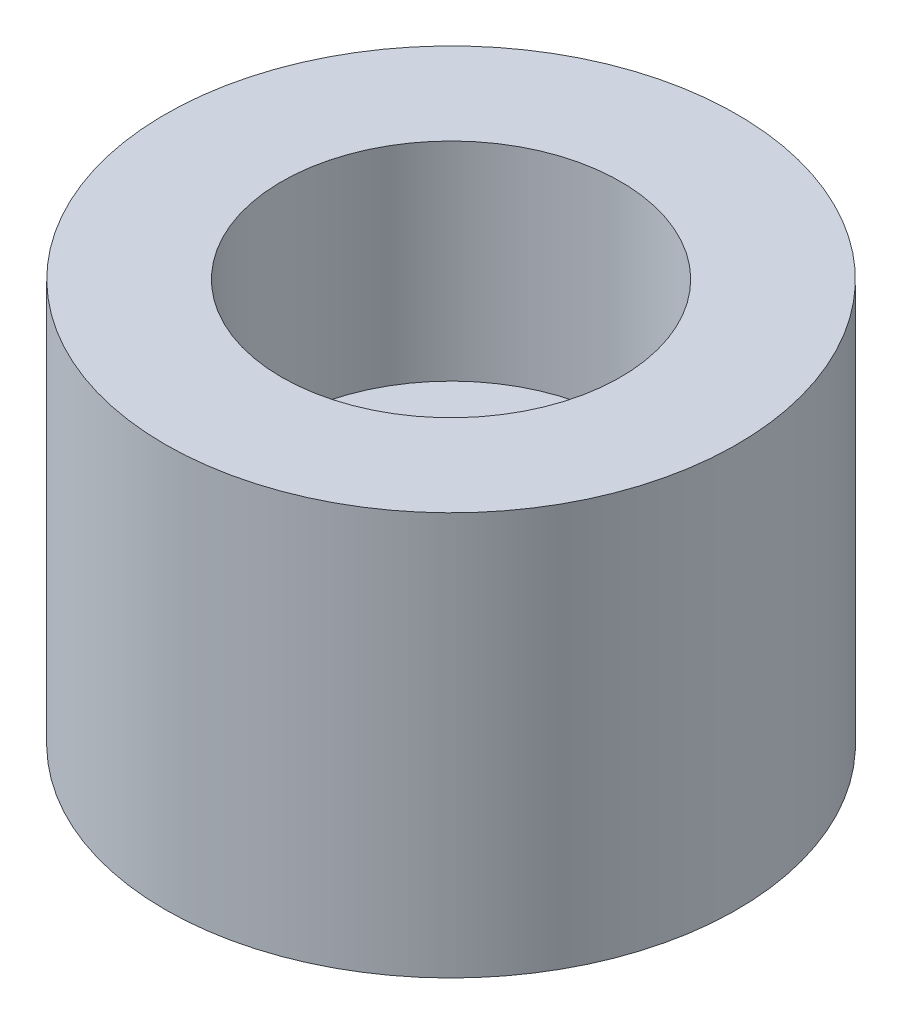
ISO-10303-21;
HEADER;
FILE_DESCRIPTION(('STEP AP214'),'2;1');
FILE_NAME('part.step','',(''),(''),'','','');
FILE_SCHEMA(('AUTOMOTIVE_DESIGN { 1 0 10303 214 1 1 1 1 }'));
ENDSEC;
DATA;
#1=APPLICATION_CONTEXT('core data for automotive mechanical design processes');
#2=APPLICATION_PROTOCOL_DEFINITION('international standard','automotive_design',2000,#1);
#3=PRODUCT_CONTEXT('',#1,'mechanical');
#4=PRODUCT('Part','Part','',(#3));
#5=PRODUCT_RELATED_PRODUCT_CATEGORY('part','',(#4));
#6=PRODUCT_DEFINITION_FORMATION('','',#4);
#7=PRODUCT_DEFINITION_CONTEXT('part definition',#1,'design');
#8=PRODUCT_DEFINITION('design','',#6,#7);
#9=PRODUCT_DEFINITION_SHAPE('','',#8);
#10=(LENGTH_UNIT() NAMED_UNIT(*) SI_UNIT(.MILLI.,.METRE.));
#11=(NAMED_UNIT(*) PLANE_ANGLE_UNIT() SI_UNIT($,.RADIAN.));
#12=(NAMED_UNIT(*) SI_UNIT($,.STERADIAN.) SOLID_ANGLE_UNIT());
#13=UNCERTAINTY_MEASURE_WITH_UNIT(LENGTH_MEASURE(1.E-05),#10,'distance_accuracy_value','');
#14=(GEOMETRIC_REPRESENTATION_CONTEXT(3) GLOBAL_UNCERTAINTY_ASSIGNED_CONTEXT((#13)) GLOBAL_UNIT_ASSIGNED_CONTEXT((#10,
#11,#12)) REPRESENTATION_CONTEXT('',''));
#15=CARTESIAN_POINT('',(0.,0.,0.));
#16=DIRECTION('',(0.,0.,1.));
#17=DIRECTION('',(1.,0.,0.));
#18=AXIS2_PLACEMENT_3D('',#15,#16,#17);
#19=CARTESIAN_POINT('',(0.,0.,0.));
#20=DIRECTION('',(0.,1.,0.));
#21=DIRECTION('',(0.,0.,1.));
#22=AXIS2_PLACEMENT_3D('',#19,#20,#21);
#23=PLANE('',#22);
#24=CARTESIAN_POINT('',(0.,0.,0.));
#25=DIRECTION('',(0.,1.,0.));
#26=DIRECTION('',(0.,0.,1.));
#27=AXIS2_PLACEMENT_3D('',#24,#25,#26);
#28=CIRCLE('',#27,27.5);
#29=CARTESIAN_POINT('',(0.,0.,27.5));
#30=VERTEX_POINT('',#29);
#31=EDGE_CURVE('E37',#30,#30,#28,.T.);
#32=ORIENTED_EDGE('',*,*,#31,.F.);
#33=EDGE_LOOP('',(#32));
#34=FACE_BOUND('',#33,.T.);
#35=CARTESIAN_POINT('',(0.,0.,0.));
#36=DIRECTION('',(0.,1.,0.));
#37=DIRECTION('',(0.,0.,1.));
#38=AXIS2_PLACEMENT_3D('',#35,#36,#37);
#39=CIRCLE('',#38,23.9);
#40=CARTESIAN_POINT('',(0.,0.,23.9));
#41=VERTEX_POINT('',#40);
#42=EDGE_CURVE('E41',#41,#41,#39,.T.);
#43=ORIENTED_EDGE('',*,*,#42,.T.);
#44=EDGE_LOOP('',(#43));
#45=FACE_BOUND('',#44,.T.);
#46=ADVANCED_FACE('F30',(#34,#45),#23,.F.);
#47=CARTESIAN_POINT('',(0.,10.75,0.));
#48=DIRECTION('',(0.,-1.,0.));
#49=DIRECTION('',(0.,0.,-1.));
#50=AXIS2_PLACEMENT_3D('',#47,#48,#49);
#51=CYLINDRICAL_SURFACE('',#50,27.5);
#52=ORIENTED_EDGE('',*,*,#31,.T.);
#53=EDGE_LOOP('',(#52));
#54=FACE_BOUND('',#53,.T.);
#55=CARTESIAN_POINT('',(0.,38.75,0.));
#56=DIRECTION('',(0.,1.,0.));
#57=DIRECTION('',(0.,0.,1.));
#58=AXIS2_PLACEMENT_3D('',#55,#56,#57);
#59=CIRCLE('',#58,27.5);
#60=CARTESIAN_POINT('',(0.,38.75,27.5));
#61=VERTEX_POINT('',#60);
#62=EDGE_CURVE('E56',#61,#61,#59,.T.);
#63=ORIENTED_EDGE('',*,*,#62,.F.);
#64=EDGE_LOOP('',(#63));
#65=FACE_BOUND('',#64,.T.);
#66=ADVANCED_FACE('F32',(#54,#65),#51,.T.);
#67=CARTESIAN_POINT('',(0.,10.75,0.));
#68=DIRECTION('',(0.,-1.,0.));
#69=DIRECTION('',(0.,0.,-1.));
#70=AXIS2_PLACEMENT_3D('',#67,#68,#69);
#71=CYLINDRICAL_SURFACE('',#70,23.9);
#72=CARTESIAN_POINT('',(0.,10.75,0.));
#73=DIRECTION('',(0.,1.,0.));
#74=DIRECTION('',(0.,0.,1.));
#75=AXIS2_PLACEMENT_3D('',#72,#73,#74);
#76=CIRCLE('',#75,23.9);
#77=CARTESIAN_POINT('',(0.,10.75,23.9));
#78=VERTEX_POINT('',#77);
#79=EDGE_CURVE('E45',#78,#78,#76,.T.);
#80=ORIENTED_EDGE('',*,*,#79,.T.);
#81=EDGE_LOOP('',(#80));
#82=FACE_BOUND('',#81,.T.);
#83=ORIENTED_EDGE('',*,*,#42,.F.);
#84=EDGE_LOOP('',(#83));
#85=FACE_BOUND('',#84,.T.);
#86=ADVANCED_FACE('F85',(#82,#85),#71,.F.);
#87=CARTESIAN_POINT('',(0.,10.75,0.));
#88=DIRECTION('',(0.,1.,0.));
#89=DIRECTION('',(0.,0.,1.));
#90=AXIS2_PLACEMENT_3D('',#87,#88,#89);
#91=PLANE('',#90);
#92=CARTESIAN_POINT('',(0.,10.75,0.));
#93=DIRECTION('',(0.,1.,0.));
#94=DIRECTION('',(0.,0.,1.));
#95=AXIS2_PLACEMENT_3D('',#92,#93,#94);
#96=CIRCLE('',#95,21.5);
#97=CARTESIAN_POINT('',(0.,10.75,21.5));
#98=VERTEX_POINT('',#97);
#99=EDGE_CURVE('E50',#98,#98,#96,.T.);
#100=ORIENTED_EDGE('',*,*,#99,.T.);
#101=EDGE_LOOP('',(#100));
#102=FACE_BOUND('',#101,.T.);
#103=ORIENTED_EDGE('',*,*,#79,.F.);
#104=EDGE_LOOP('',(#103));
#105=FACE_BOUND('',#104,.T.);
#106=ADVANCED_FACE('F90',(#102,#105),#91,.F.);
#107=CARTESIAN_POINT('',(0.,13.75,0.));
#108=DIRECTION('',(0.,-1.,0.));
#109=DIRECTION('',(0.,0.,-1.));
#110=AXIS2_PLACEMENT_3D('',#107,#108,#109);
#111=CYLINDRICAL_SURFACE('',#110,21.5);
#112=CARTESIAN_POINT('',(0.,13.75,0.));
#113=DIRECTION('',(0.,1.,0.));
#114=DIRECTION('',(0.,0.,1.));
#115=AXIS2_PLACEMENT_3D('',#112,#113,#114);
#116=CIRCLE('',#115,21.5);
#117=CARTESIAN_POINT('',(0.,13.75,21.5));
#118=VERTEX_POINT('',#117);
#119=EDGE_CURVE('E53',#118,#118,#116,.T.);
#120=ORIENTED_EDGE('',*,*,#119,.T.);
#121=EDGE_LOOP('',(#120));
#122=FACE_BOUND('',#121,.T.);
#123=ORIENTED_EDGE('',*,*,#99,.F.);
#124=EDGE_LOOP('',(#123));
#125=FACE_BOUND('',#124,.T.);
#126=ADVANCED_FACE('F76',(#122,#125),#111,.F.);
#127=CARTESIAN_POINT('',(0.,13.75,0.));
#128=DIRECTION('',(0.,1.,0.));
#129=DIRECTION('',(0.,0.,1.));
#130=AXIS2_PLACEMENT_3D('',#127,#128,#129);
#131=PLANE('',#130);
#132=ORIENTED_EDGE('',*,*,#119,.F.);
#133=EDGE_LOOP('',(#132));
#134=FACE_BOUND('',#133,.T.);
#135=ADVANCED_FACE('F67',(#134),#131,.F.);
#136=CARTESIAN_POINT('',(0.,38.75,0.));
#137=DIRECTION('',(0.,1.,0.));
#138=DIRECTION('',(0.,0.,1.));
#139=AXIS2_PLACEMENT_3D('',#136,#137,#138);
#140=PLANE('',#139);
#141=ORIENTED_EDGE('',*,*,#62,.T.);
#142=EDGE_LOOP('',(#141));
#143=FACE_BOUND('',#142,.T.);
#144=CARTESIAN_POINT('',(0.,38.75,0.));
#145=DIRECTION('',(0.,1.,0.));
#146=DIRECTION('',(0.,0.,1.));
#147=AXIS2_PLACEMENT_3D('',#144,#145,#146);
#148=CIRCLE('',#147,16.3);
#149=CARTESIAN_POINT('',(0.,38.75,16.3));
#150=VERTEX_POINT('',#149);
#151=EDGE_CURVE('E59',#150,#150,#148,.T.);
#152=ORIENTED_EDGE('',*,*,#151,.F.);
#153=EDGE_LOOP('',(#152));
#154=FACE_BOUND('',#153,.T.);
#155=ADVANCED_FACE('F65',(#143,#154),#140,.T.);
#156=CARTESIAN_POINT('',(0.,38.75,0.));
#157=DIRECTION('',(0.,-1.,0.));
#158=DIRECTION('',(0.,0.,-1.));
#159=AXIS2_PLACEMENT_3D('',#156,#157,#158);
#160=CYLINDRICAL_SURFACE('',#159,16.3);
#161=ORIENTED_EDGE('',*,*,#151,.T.);
#162=EDGE_LOOP('',(#161));
#163=FACE_BOUND('',#162,.T.);
#164=CARTESIAN_POINT('',(0.,18.75,0.));
#165=DIRECTION('',(0.,1.,0.));
#166=DIRECTION('',(0.,0.,1.));
#167=AXIS2_PLACEMENT_3D('',#164,#165,#166);
#168=CIRCLE('',#167,16.3);
#169=CARTESIAN_POINT('',(0.,18.75,16.3));
#170=VERTEX_POINT('',#169);
#171=EDGE_CURVE('E10',#170,#170,#168,.F.);
#172=ORIENTED_EDGE('',*,*,#171,.T.);
#173=EDGE_LOOP('',(#172));
#174=FACE_BOUND('',#173,.T.);
#175=ADVANCED_FACE('F63',(#163,#174),#160,.F.);
#176=CARTESIAN_POINT('',(0.,18.75,0.));
#177=DIRECTION('',(0.,1.,0.));
#178=DIRECTION('',(0.,0.,1.));
#179=AXIS2_PLACEMENT_3D('',#176,#177,#178);
#180=PLANE('',#179);
#181=ORIENTED_EDGE('',*,*,#171,.F.);
#182=EDGE_LOOP('',(#181));
#183=FACE_BOUND('',#182,.T.);
#184=ADVANCED_FACE('F74',(#183),#180,.T.);
#185=CLOSED_SHELL('',(#46,#66,#86,#106,#126,#135,#155,#175,#184));
#186=MANIFOLD_SOLID_BREP('B2',#185);
#187=ADVANCED_BREP_SHAPE_REPRESENTATION('',(#18,#186),#14);
#188=SHAPE_DEFINITION_REPRESENTATION(#9,#187);
ENDSEC;
END-ISO-10303-21;
